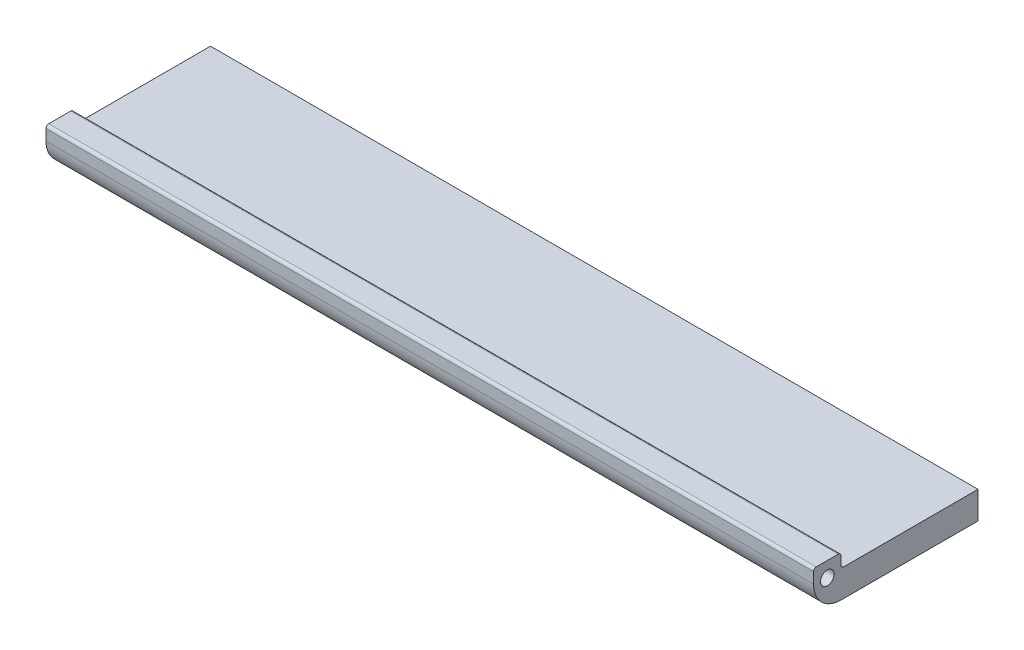
ISO-10303-21;
HEADER;
FILE_DESCRIPTION(('STEP AP214'),'2;1');
FILE_NAME('part.step','',(''),(''),'','','');
FILE_SCHEMA(('AUTOMOTIVE_DESIGN { 1 0 10303 214 1 1 1 1 }'));
ENDSEC;
DATA;
#1=APPLICATION_CONTEXT('core data for automotive mechanical design processes');
#2=APPLICATION_PROTOCOL_DEFINITION('international standard','automotive_design',2000,#1);
#3=PRODUCT_CONTEXT('',#1,'mechanical');
#4=PRODUCT('Part','Part','',(#3));
#5=PRODUCT_RELATED_PRODUCT_CATEGORY('part','',(#4));
#6=PRODUCT_DEFINITION_FORMATION('','',#4);
#7=PRODUCT_DEFINITION_CONTEXT('part definition',#1,'design');
#8=PRODUCT_DEFINITION('design','',#6,#7);
#9=PRODUCT_DEFINITION_SHAPE('','',#8);
#10=(LENGTH_UNIT() NAMED_UNIT(*) SI_UNIT(.MILLI.,.METRE.));
#11=(NAMED_UNIT(*) PLANE_ANGLE_UNIT() SI_UNIT($,.RADIAN.));
#12=(NAMED_UNIT(*) SI_UNIT($,.STERADIAN.) SOLID_ANGLE_UNIT());
#13=UNCERTAINTY_MEASURE_WITH_UNIT(LENGTH_MEASURE(1.E-05),#10,'distance_accuracy_value','');
#14=(GEOMETRIC_REPRESENTATION_CONTEXT(3) GLOBAL_UNCERTAINTY_ASSIGNED_CONTEXT((#13)) GLOBAL_UNIT_ASSIGNED_CONTEXT((#10,
#11,#12)) REPRESENTATION_CONTEXT('',''));
#15=CARTESIAN_POINT('',(0.,0.,0.));
#16=DIRECTION('',(0.,0.,1.));
#17=DIRECTION('',(1.,0.,0.));
#18=AXIS2_PLACEMENT_3D('',#15,#16,#17);
#19=CARTESIAN_POINT('',(-140.,10.,0.));
#20=DIRECTION('',(1.,0.,0.));
#21=DIRECTION('',(0.,0.,-1.));
#22=AXIS2_PLACEMENT_3D('',#19,#20,#21);
#23=PLANE('',#22);
#24=CARTESIAN_POINT('',(-140.,9.5,55.));
#25=DIRECTION('',(1.,0.,0.));
#26=DIRECTION('',(0.,0.,-1.));
#27=AXIS2_PLACEMENT_3D('',#24,#25,#26);
#28=CIRCLE('',#27,2.5);
#29=CARTESIAN_POINT('',(-140.,9.5,52.5));
#30=VERTEX_POINT('',#29);
#31=EDGE_CURVE('E157',#30,#30,#28,.T.);
#32=ORIENTED_EDGE('',*,*,#31,.T.);
#33=EDGE_LOOP('',(#32));
#34=FACE_BOUND('',#33,.T.);
#35=DIRECTION('',(0.,0.,1.));
#36=VECTOR('',#35,1.);
#37=CARTESIAN_POINT('',(-140.,15.,60.));
#38=LINE('',#37,#36);
#39=CARTESIAN_POINT('',(-140.,15.,51.));
#40=VERTEX_POINT('',#39);
#41=CARTESIAN_POINT('',(-140.,15.,59.));
#42=VERTEX_POINT('',#41);
#43=EDGE_CURVE('E155',#40,#42,#38,.T.);
#44=ORIENTED_EDGE('',*,*,#43,.F.);
#45=CARTESIAN_POINT('',(-140.,14.,51.));
#46=DIRECTION('',(1.,0.,0.));
#47=DIRECTION('',(0.,0.,-1.));
#48=AXIS2_PLACEMENT_3D('',#45,#46,#47);
#49=CIRCLE('',#48,1.);
#50=CARTESIAN_POINT('',(-140.,14.,50.));
#51=VERTEX_POINT('',#50);
#52=EDGE_CURVE('E209',#40,#51,#49,.F.);
#53=ORIENTED_EDGE('',*,*,#52,.T.);
#54=DIRECTION('',(0.,-1.,0.));
#55=VECTOR('',#54,1.);
#56=CARTESIAN_POINT('',(-140.,15.,50.));
#57=LINE('',#56,#55);
#58=CARTESIAN_POINT('',(-140.,11.,50.));
#59=VERTEX_POINT('',#58);
#60=EDGE_CURVE('E154',#51,#59,#57,.T.);
#61=ORIENTED_EDGE('',*,*,#60,.T.);
#62=CARTESIAN_POINT('',(-140.,11.,49.));
#63=DIRECTION('',(1.,0.,0.));
#64=DIRECTION('',(0.,0.,-1.));
#65=AXIS2_PLACEMENT_3D('',#62,#63,#64);
#66=CIRCLE('',#65,1.);
#67=CARTESIAN_POINT('',(-140.,10.,49.));
#68=VERTEX_POINT('',#67);
#69=EDGE_CURVE('E41',#59,#68,#66,.T.);
#70=ORIENTED_EDGE('',*,*,#69,.T.);
#71=DIRECTION('',(0.,0.,1.));
#72=VECTOR('',#71,1.);
#73=CARTESIAN_POINT('',(-140.,10.,0.));
#74=LINE('',#73,#72);
#75=CARTESIAN_POINT('',(-140.,10.,0.));
#76=VERTEX_POINT('',#75);
#77=EDGE_CURVE('E114',#76,#68,#74,.T.);
#78=ORIENTED_EDGE('',*,*,#77,.F.);
#79=DIRECTION('',(0.,-1.,0.));
#80=VECTOR('',#79,1.);
#81=CARTESIAN_POINT('',(-140.,10.,0.));
#82=LINE('',#81,#80);
#83=CARTESIAN_POINT('',(-140.,0.,0.));
#84=VERTEX_POINT('',#83);
#85=EDGE_CURVE('E125',#76,#84,#82,.T.);
#86=ORIENTED_EDGE('',*,*,#85,.T.);
#87=DIRECTION('',(0.,0.,1.));
#88=VECTOR('',#87,1.);
#89=CARTESIAN_POINT('',(-140.,0.,0.));
#90=LINE('',#89,#88);
#91=CARTESIAN_POINT('',(-140.,0.,50.));
#92=VERTEX_POINT('',#91);
#93=EDGE_CURVE('E135',#84,#92,#90,.T.);
#94=ORIENTED_EDGE('',*,*,#93,.T.);
#95=CARTESIAN_POINT('',(-140.,10.,50.));
#96=DIRECTION('',(1.,0.,0.));
#97=DIRECTION('',(0.,0.,-1.));
#98=AXIS2_PLACEMENT_3D('',#95,#96,#97);
#99=CIRCLE('',#98,10.);
#100=CARTESIAN_POINT('',(-140.,10.,60.));
#101=VERTEX_POINT('',#100);
#102=EDGE_CURVE('E224',#92,#101,#99,.F.);
#103=ORIENTED_EDGE('',*,*,#102,.T.);
#104=DIRECTION('',(0.,-1.,0.));
#105=VECTOR('',#104,1.);
#106=CARTESIAN_POINT('',(-140.,10.,60.));
#107=LINE('',#106,#105);
#108=CARTESIAN_POINT('',(-140.,14.,60.));
#109=VERTEX_POINT('',#108);
#110=EDGE_CURVE('E143',#109,#101,#107,.T.);
#111=ORIENTED_EDGE('',*,*,#110,.F.);
#112=CARTESIAN_POINT('',(-140.,14.,59.));
#113=DIRECTION('',(1.,0.,0.));
#114=DIRECTION('',(0.,0.,-1.));
#115=AXIS2_PLACEMENT_3D('',#112,#113,#114);
#116=CIRCLE('',#115,1.);
#117=EDGE_CURVE('E234',#109,#42,#116,.F.);
#118=ORIENTED_EDGE('',*,*,#117,.T.);
#119=EDGE_LOOP('',(#44,#53,#61,#70,#78,#86,#94,#103,#111,#118));
#120=FACE_BOUND('',#119,.T.);
#121=ADVANCED_FACE('F33',(#34,#120),#23,.F.);
#122=CARTESIAN_POINT('',(-140.,10.,60.));
#123=DIRECTION('',(0.,0.,-1.));
#124=DIRECTION('',(-1.,0.,0.));
#125=AXIS2_PLACEMENT_3D('',#122,#123,#124);
#126=PLANE('',#125);
#127=DIRECTION('',(0.,-1.,0.));
#128=VECTOR('',#127,1.);
#129=CARTESIAN_POINT('',(140.,10.,60.));
#130=LINE('',#129,#128);
#131=CARTESIAN_POINT('',(140.,14.,60.));
#132=VERTEX_POINT('',#131);
#133=CARTESIAN_POINT('',(140.,10.,60.));
#134=VERTEX_POINT('',#133);
#135=EDGE_CURVE('E124',#132,#134,#130,.T.);
#136=ORIENTED_EDGE('',*,*,#135,.F.);
#137=DIRECTION('',(1.,0.,0.));
#138=VECTOR('',#137,1.);
#139=CARTESIAN_POINT('',(-140.,14.,60.));
#140=LINE('',#139,#138);
#141=EDGE_CURVE('E232',#132,#109,#140,.F.);
#142=ORIENTED_EDGE('',*,*,#141,.T.);
#143=ORIENTED_EDGE('',*,*,#110,.T.);
#144=DIRECTION('',(1.,0.,0.));
#145=VECTOR('',#144,1.);
#146=CARTESIAN_POINT('',(-140.,10.,60.));
#147=LINE('',#146,#145);
#148=EDGE_CURVE('E145',#101,#134,#147,.T.);
#149=ORIENTED_EDGE('',*,*,#148,.T.);
#150=EDGE_LOOP('',(#136,#142,#143,#149));
#151=FACE_BOUND('',#150,.T.);
#152=ADVANCED_FACE('F168',(#151),#126,.F.);
#153=CARTESIAN_POINT('',(140.,10.,0.));
#154=DIRECTION('',(-1.,0.,0.));
#155=DIRECTION('',(0.,0.,1.));
#156=AXIS2_PLACEMENT_3D('',#153,#154,#155);
#157=PLANE('',#156);
#158=CARTESIAN_POINT('',(140.,9.5,55.));
#159=DIRECTION('',(1.,0.,0.));
#160=DIRECTION('',(0.,0.,-1.));
#161=AXIS2_PLACEMENT_3D('',#158,#159,#160);
#162=CIRCLE('',#161,2.5);
#163=CARTESIAN_POINT('',(140.,9.5,52.5));
#164=VERTEX_POINT('',#163);
#165=EDGE_CURVE('E160',#164,#164,#162,.T.);
#166=ORIENTED_EDGE('',*,*,#165,.F.);
#167=EDGE_LOOP('',(#166));
#168=FACE_BOUND('',#167,.T.);
#169=DIRECTION('',(0.,-1.,0.));
#170=VECTOR('',#169,1.);
#171=CARTESIAN_POINT('',(140.,15.,50.));
#172=LINE('',#171,#170);
#173=CARTESIAN_POINT('',(140.,14.,50.));
#174=VERTEX_POINT('',#173);
#175=CARTESIAN_POINT('',(140.,11.,50.));
#176=VERTEX_POINT('',#175);
#177=EDGE_CURVE('E138',#174,#176,#172,.T.);
#178=ORIENTED_EDGE('',*,*,#177,.F.);
#179=CARTESIAN_POINT('',(140.,14.,51.));
#180=DIRECTION('',(-1.,0.,0.));
#181=DIRECTION('',(0.,0.,1.));
#182=AXIS2_PLACEMENT_3D('',#179,#180,#181);
#183=CIRCLE('',#182,1.);
#184=CARTESIAN_POINT('',(140.,15.,51.));
#185=VERTEX_POINT('',#184);
#186=EDGE_CURVE('E200',#174,#185,#183,.F.);
#187=ORIENTED_EDGE('',*,*,#186,.T.);
#188=DIRECTION('',(0.,0.,-1.));
#189=VECTOR('',#188,1.);
#190=CARTESIAN_POINT('',(140.,15.,60.));
#191=LINE('',#190,#189);
#192=CARTESIAN_POINT('',(140.,15.,59.));
#193=VERTEX_POINT('',#192);
#194=EDGE_CURVE('E151',#193,#185,#191,.T.);
#195=ORIENTED_EDGE('',*,*,#194,.F.);
#196=CARTESIAN_POINT('',(140.,14.,59.));
#197=DIRECTION('',(-1.,0.,0.));
#198=DIRECTION('',(0.,0.,1.));
#199=AXIS2_PLACEMENT_3D('',#196,#197,#198);
#200=CIRCLE('',#199,1.);
#201=EDGE_CURVE('E230',#193,#132,#200,.F.);
#202=ORIENTED_EDGE('',*,*,#201,.T.);
#203=ORIENTED_EDGE('',*,*,#135,.T.);
#204=CARTESIAN_POINT('',(140.,10.,50.));
#205=DIRECTION('',(-1.,0.,0.));
#206=DIRECTION('',(0.,0.,1.));
#207=AXIS2_PLACEMENT_3D('',#204,#205,#206);
#208=CIRCLE('',#207,10.);
#209=CARTESIAN_POINT('',(140.,0.,50.));
#210=VERTEX_POINT('',#209);
#211=EDGE_CURVE('E220',#134,#210,#208,.F.);
#212=ORIENTED_EDGE('',*,*,#211,.T.);
#213=DIRECTION('',(0.,0.,-1.));
#214=VECTOR('',#213,1.);
#215=CARTESIAN_POINT('',(140.,0.,0.));
#216=LINE('',#215,#214);
#217=CARTESIAN_POINT('',(140.,0.,0.));
#218=VERTEX_POINT('',#217);
#219=EDGE_CURVE('E121',#210,#218,#216,.T.);
#220=ORIENTED_EDGE('',*,*,#219,.T.);
#221=DIRECTION('',(0.,-1.,0.));
#222=VECTOR('',#221,1.);
#223=CARTESIAN_POINT('',(140.,10.,0.));
#224=LINE('',#223,#222);
#225=CARTESIAN_POINT('',(140.,10.,0.));
#226=VERTEX_POINT('',#225);
#227=EDGE_CURVE('E117',#226,#218,#224,.T.);
#228=ORIENTED_EDGE('',*,*,#227,.F.);
#229=DIRECTION('',(0.,0.,-1.));
#230=VECTOR('',#229,1.);
#231=CARTESIAN_POINT('',(140.,10.,0.));
#232=LINE('',#231,#230);
#233=CARTESIAN_POINT('',(140.,10.,49.));
#234=VERTEX_POINT('',#233);
#235=EDGE_CURVE('E106',#234,#226,#232,.T.);
#236=ORIENTED_EDGE('',*,*,#235,.F.);
#237=CARTESIAN_POINT('',(140.,11.,49.));
#238=DIRECTION('',(-1.,0.,0.));
#239=DIRECTION('',(0.,0.,1.));
#240=AXIS2_PLACEMENT_3D('',#237,#238,#239);
#241=CIRCLE('',#240,1.);
#242=EDGE_CURVE('E11',#234,#176,#241,.T.);
#243=ORIENTED_EDGE('',*,*,#242,.T.);
#244=EDGE_LOOP('',(#178,#187,#195,#202,#203,#212,#220,#228,#236,#243));
#245=FACE_BOUND('',#244,.T.);
#246=ADVANCED_FACE('F119',(#168,#245),#157,.F.);
#247=CARTESIAN_POINT('',(-140.,10.,0.));
#248=DIRECTION('',(0.,0.,1.));
#249=DIRECTION('',(1.,0.,0.));
#250=AXIS2_PLACEMENT_3D('',#247,#248,#249);
#251=PLANE('',#250);
#252=DIRECTION('',(-1.,0.,0.));
#253=VECTOR('',#252,1.);
#254=CARTESIAN_POINT('',(-140.,0.,0.));
#255=LINE('',#254,#253);
#256=EDGE_CURVE('E140',#218,#84,#255,.T.);
#257=ORIENTED_EDGE('',*,*,#256,.T.);
#258=ORIENTED_EDGE('',*,*,#85,.F.);
#259=DIRECTION('',(-1.,0.,0.));
#260=VECTOR('',#259,1.);
#261=CARTESIAN_POINT('',(-140.,10.,0.));
#262=LINE('',#261,#260);
#263=EDGE_CURVE('E110',#226,#76,#262,.T.);
#264=ORIENTED_EDGE('',*,*,#263,.F.);
#265=ORIENTED_EDGE('',*,*,#227,.T.);
#266=EDGE_LOOP('',(#257,#258,#264,#265));
#267=FACE_BOUND('',#266,.T.);
#268=ADVANCED_FACE('F127',(#267),#251,.F.);
#269=CARTESIAN_POINT('',(0.,10.,0.));
#270=DIRECTION('',(0.,1.,0.));
#271=DIRECTION('',(0.,0.,1.));
#272=AXIS2_PLACEMENT_3D('',#269,#270,#271);
#273=PLANE('',#272);
#274=ORIENTED_EDGE('',*,*,#77,.T.);
#275=DIRECTION('',(-1.,0.,0.));
#276=VECTOR('',#275,1.);
#277=CARTESIAN_POINT('',(0.,10.,49.));
#278=LINE('',#277,#276);
#279=EDGE_CURVE('E54',#68,#234,#278,.F.);
#280=ORIENTED_EDGE('',*,*,#279,.T.);
#281=ORIENTED_EDGE('',*,*,#235,.T.);
#282=ORIENTED_EDGE('',*,*,#263,.T.);
#283=EDGE_LOOP('',(#274,#280,#281,#282));
#284=FACE_BOUND('',#283,.T.);
#285=ADVANCED_FACE('F108',(#284),#273,.T.);
#286=CARTESIAN_POINT('',(0.,0.,0.));
#287=DIRECTION('',(0.,1.,0.));
#288=DIRECTION('',(0.,0.,1.));
#289=AXIS2_PLACEMENT_3D('',#286,#287,#288);
#290=PLANE('',#289);
#291=ORIENTED_EDGE('',*,*,#219,.F.);
#292=DIRECTION('',(1.,0.,0.));
#293=VECTOR('',#292,1.);
#294=CARTESIAN_POINT('',(0.,0.,50.));
#295=LINE('',#294,#293);
#296=EDGE_CURVE('E222',#210,#92,#295,.F.);
#297=ORIENTED_EDGE('',*,*,#296,.T.);
#298=ORIENTED_EDGE('',*,*,#93,.F.);
#299=ORIENTED_EDGE('',*,*,#256,.F.);
#300=EDGE_LOOP('',(#291,#297,#298,#299));
#301=FACE_BOUND('',#300,.T.);
#302=ADVANCED_FACE('F244',(#301),#290,.F.);
#303=CARTESIAN_POINT('',(-140.,15.,50.));
#304=DIRECTION('',(0.,0.,1.));
#305=DIRECTION('',(1.,0.,0.));
#306=AXIS2_PLACEMENT_3D('',#303,#304,#305);
#307=PLANE('',#306);
#308=ORIENTED_EDGE('',*,*,#177,.T.);
#309=DIRECTION('',(-1.,0.,0.));
#310=VECTOR('',#309,1.);
#311=CARTESIAN_POINT('',(-140.,11.,50.));
#312=LINE('',#311,#310);
#313=EDGE_CURVE('E205',#176,#59,#312,.T.);
#314=ORIENTED_EDGE('',*,*,#313,.T.);
#315=ORIENTED_EDGE('',*,*,#60,.F.);
#316=DIRECTION('',(-1.,0.,0.));
#317=VECTOR('',#316,1.);
#318=CARTESIAN_POINT('',(-140.,14.,50.));
#319=LINE('',#318,#317);
#320=EDGE_CURVE('E201',#51,#174,#319,.F.);
#321=ORIENTED_EDGE('',*,*,#320,.T.);
#322=EDGE_LOOP('',(#308,#314,#315,#321));
#323=FACE_BOUND('',#322,.T.);
#324=ADVANCED_FACE('F240',(#323),#307,.F.);
#325=CARTESIAN_POINT('',(0.,15.,0.));
#326=DIRECTION('',(0.,-1.,0.));
#327=DIRECTION('',(0.,0.,-1.));
#328=AXIS2_PLACEMENT_3D('',#325,#326,#327);
#329=PLANE('',#328);
#330=ORIENTED_EDGE('',*,*,#194,.T.);
#331=DIRECTION('',(-1.,0.,0.));
#332=VECTOR('',#331,1.);
#333=CARTESIAN_POINT('',(0.,15.,51.));
#334=LINE('',#333,#332);
#335=EDGE_CURVE('E203',#185,#40,#334,.T.);
#336=ORIENTED_EDGE('',*,*,#335,.T.);
#337=ORIENTED_EDGE('',*,*,#43,.T.);
#338=DIRECTION('',(1.,0.,0.));
#339=VECTOR('',#338,1.);
#340=CARTESIAN_POINT('',(0.,15.,59.));
#341=LINE('',#340,#339);
#342=EDGE_CURVE('E227',#42,#193,#341,.T.);
#343=ORIENTED_EDGE('',*,*,#342,.T.);
#344=EDGE_LOOP('',(#330,#336,#337,#343));
#345=FACE_BOUND('',#344,.T.);
#346=ADVANCED_FACE('F243',(#345),#329,.F.);
#347=CARTESIAN_POINT('',(-140.00005,9.5,55.));
#348=DIRECTION('',(1.,0.,0.));
#349=DIRECTION('',(0.,0.,-1.));
#350=AXIS2_PLACEMENT_3D('',#347,#348,#349);
#351=CYLINDRICAL_SURFACE('',#350,2.5);
#352=CARTESIAN_POINT('',(140.,9.5,52.5));
#353=CARTESIAN_POINT('',(137.083333333333,9.5,52.5));
#354=CARTESIAN_POINT('',(134.166666666667,9.5,52.5));
#355=CARTESIAN_POINT('',(128.333333333333,9.5,52.5));
#356=CARTESIAN_POINT('',(125.416666666667,9.5,52.5));
#357=CARTESIAN_POINT('',(119.583333333333,9.5,52.5));
#358=CARTESIAN_POINT('',(116.666666666667,9.5,52.5));
#359=CARTESIAN_POINT('',(110.833333333333,9.5,52.5));
#360=CARTESIAN_POINT('',(107.916666666667,9.5,52.5));
#361=CARTESIAN_POINT('',(102.083333333333,9.5,52.5));
#362=CARTESIAN_POINT('',(99.1666666666666,9.5,52.5));
#363=CARTESIAN_POINT('',(93.3333333333333,9.5,52.5));
#364=CARTESIAN_POINT('',(90.4166666666667,9.5,52.5));
#365=CARTESIAN_POINT('',(84.5833333333333,9.5,52.5));
#366=CARTESIAN_POINT('',(81.6666666666667,9.5,52.5));
#367=CARTESIAN_POINT('',(75.8333333333333,9.5,52.5));
#368=CARTESIAN_POINT('',(72.9166666666666,9.5,52.5));
#369=CARTESIAN_POINT('',(67.0833333333333,9.5,52.5));
#370=CARTESIAN_POINT('',(64.1666666666666,9.5,52.5));
#371=CARTESIAN_POINT('',(58.3333333333333,9.5,52.5));
#372=CARTESIAN_POINT('',(55.4166666666666,9.5,52.5));
#373=CARTESIAN_POINT('',(49.5833333333333,9.5,52.5));
#374=CARTESIAN_POINT('',(46.6666666666666,9.5,52.5));
#375=CARTESIAN_POINT('',(40.8333333333333,9.5,52.5));
#376=CARTESIAN_POINT('',(37.9166666666667,9.5,52.5));
#377=CARTESIAN_POINT('',(32.0833333333333,9.5,52.5));
#378=CARTESIAN_POINT('',(29.1666666666666,9.5,52.5));
#379=CARTESIAN_POINT('',(23.3333333333333,9.5,52.5));
#380=CARTESIAN_POINT('',(20.4166666666667,9.5,52.5));
#381=CARTESIAN_POINT('',(14.5833333333333,9.5,52.5));
#382=CARTESIAN_POINT('',(11.6666666666667,9.5,52.5));
#383=CARTESIAN_POINT('',(5.83333333333331,9.5,52.5));
#384=CARTESIAN_POINT('',(2.91666666666664,9.5,52.5));
#385=CARTESIAN_POINT('',(-2.9166666666667,9.5,52.5));
#386=CARTESIAN_POINT('',(-5.83333333333337,9.5,52.5));
#387=CARTESIAN_POINT('',(-11.6666666666667,9.5,52.5));
#388=CARTESIAN_POINT('',(-14.5833333333334,9.5,52.5));
#389=CARTESIAN_POINT('',(-20.4166666666667,9.5,52.5));
#390=CARTESIAN_POINT('',(-23.3333333333333,9.5,52.5));
#391=CARTESIAN_POINT('',(-29.1666666666667,9.5,52.5));
#392=CARTESIAN_POINT('',(-32.0833333333333,9.5,52.5));
#393=CARTESIAN_POINT('',(-37.9166666666667,9.5,52.5));
#394=CARTESIAN_POINT('',(-40.8333333333333,9.5,52.5));
#395=CARTESIAN_POINT('',(-46.6666666666667,9.5,52.5));
#396=CARTESIAN_POINT('',(-49.5833333333333,9.5,52.5));
#397=CARTESIAN_POINT('',(-55.4166666666667,9.5,52.5));
#398=CARTESIAN_POINT('',(-58.3333333333333,9.5,52.5));
#399=CARTESIAN_POINT('',(-64.1666666666667,9.5,52.5));
#400=CARTESIAN_POINT('',(-67.0833333333334,9.5,52.5));
#401=CARTESIAN_POINT('',(-72.9166666666667,9.5,52.5));
#402=CARTESIAN_POINT('',(-75.8333333333333,9.5,52.5));
#403=CARTESIAN_POINT('',(-81.6666666666667,9.5,52.5));
#404=CARTESIAN_POINT('',(-84.5833333333334,9.5,52.5));
#405=CARTESIAN_POINT('',(-90.4166666666667,9.5,52.5));
#406=CARTESIAN_POINT('',(-93.3333333333333,9.5,52.5));
#407=CARTESIAN_POINT('',(-99.1666666666667,9.5,52.5));
#408=CARTESIAN_POINT('',(-102.083333333333,9.5,52.5));
#409=CARTESIAN_POINT('',(-107.916666666667,9.5,52.5));
#410=CARTESIAN_POINT('',(-110.833333333333,9.5,52.5));
#411=CARTESIAN_POINT('',(-116.666666666667,9.5,52.5));
#412=CARTESIAN_POINT('',(-119.583333333333,9.5,52.5));
#413=CARTESIAN_POINT('',(-125.416666666667,9.5,52.5));
#414=CARTESIAN_POINT('',(-128.333333333333,9.5,52.5));
#415=CARTESIAN_POINT('',(-134.166666666667,9.5,52.5));
#416=CARTESIAN_POINT('',(-137.083333333333,9.5,52.5));
#417=CARTESIAN_POINT('',(-140.,9.5,52.5));
#418=B_SPLINE_CURVE_WITH_KNOTS('',3,(#352,#353,#354,#355,#356,#357,#358,#359,#360,#361,#362,
#363,#364,#365,#366,#367,#368,#369,#370,#371,#372,#373,#374,#375,#376,#377,#378,#379,#380,#381,
#382,#383,#384,#385,#386,#387,#388,#389,#390,#391,#392,#393,#394,#395,#396,#397,#398,#399,#400,
#401,#402,#403,#404,#405,#406,#407,#408,#409,#410,#411,#412,#413,#414,#415,#416,#417),
.UNSPECIFIED.,.F.,.F.,(4,2,2,2,2,2,2,2,2,2,2,2,2,2,2,2,2,2,2,2,2,2,2,2,2,2,2,2,2,2,2,2,4),(0.,
8.74999999999998,17.5,26.25,35.,43.75,52.5,61.25,70.,78.75,87.5,96.25,105.,113.75,122.5,131.25,
140.,148.75,157.5,166.25,175.,183.75,192.5,201.25,210.,218.75,227.5,236.25,245.,253.75,262.5,
271.25,280.),.UNSPECIFIED.);
#419=EDGE_CURVE('BSEAM164',#164,#30,#418,.T.);
#420=ORIENTED_EDGE('',*,*,#165,.T.);
#421=ORIENTED_EDGE('',*,*,#31,.F.);
#422=ORIENTED_EDGE('',*,*,#419,.T.);
#423=ORIENTED_EDGE('',*,*,#419,.F.);
#424=EDGE_LOOP('',(#420,#422,#421,#423));
#425=FACE_BOUND('',#424,.T.);
#426=ADVANCED_FACE('F164',(#425),#351,.F.);
#427=CARTESIAN_POINT('',(-140.,10.,50.));
#428=DIRECTION('',(1.,0.,0.));
#429=DIRECTION('',(0.,0.,-1.));
#430=AXIS2_PLACEMENT_3D('',#427,#428,#429);
#431=CYLINDRICAL_SURFACE('',#430,10.);
#432=ORIENTED_EDGE('',*,*,#102,.F.);
#433=ORIENTED_EDGE('',*,*,#296,.F.);
#434=ORIENTED_EDGE('',*,*,#211,.F.);
#435=ORIENTED_EDGE('',*,*,#148,.F.);
#436=EDGE_LOOP('',(#432,#433,#434,#435));
#437=FACE_BOUND('',#436,.T.);
#438=ADVANCED_FACE('F183',(#437),#431,.T.);
#439=CARTESIAN_POINT('',(0.,14.,59.));
#440=DIRECTION('',(1.,0.,0.));
#441=DIRECTION('',(0.,0.,-1.));
#442=AXIS2_PLACEMENT_3D('',#439,#440,#441);
#443=CYLINDRICAL_SURFACE('',#442,1.);
#444=ORIENTED_EDGE('',*,*,#117,.F.);
#445=ORIENTED_EDGE('',*,*,#141,.F.);
#446=ORIENTED_EDGE('',*,*,#201,.F.);
#447=ORIENTED_EDGE('',*,*,#342,.F.);
#448=EDGE_LOOP('',(#444,#445,#446,#447));
#449=FACE_BOUND('',#448,.T.);
#450=ADVANCED_FACE('F186',(#449),#443,.T.);
#451=CARTESIAN_POINT('',(0.,14.,51.));
#452=DIRECTION('',(-1.,0.,0.));
#453=DIRECTION('',(0.,0.,1.));
#454=AXIS2_PLACEMENT_3D('',#451,#452,#453);
#455=CYLINDRICAL_SURFACE('',#454,1.);
#456=ORIENTED_EDGE('',*,*,#186,.F.);
#457=ORIENTED_EDGE('',*,*,#320,.F.);
#458=ORIENTED_EDGE('',*,*,#52,.F.);
#459=ORIENTED_EDGE('',*,*,#335,.F.);
#460=EDGE_LOOP('',(#456,#457,#458,#459));
#461=FACE_BOUND('',#460,.T.);
#462=ADVANCED_FACE('F189',(#461),#455,.T.);
#463=CARTESIAN_POINT('',(-140.,11.,49.));
#464=DIRECTION('',(-1.,0.,0.));
#465=DIRECTION('',(0.,0.,1.));
#466=AXIS2_PLACEMENT_3D('',#463,#464,#465);
#467=CYLINDRICAL_SURFACE('',#466,1.);
#468=ORIENTED_EDGE('',*,*,#242,.F.);
#469=ORIENTED_EDGE('',*,*,#279,.F.);
#470=ORIENTED_EDGE('',*,*,#69,.F.);
#471=ORIENTED_EDGE('',*,*,#313,.F.);
#472=EDGE_LOOP('',(#468,#469,#470,#471));
#473=FACE_BOUND('',#472,.T.);
#474=ADVANCED_FACE('F35',(#473),#467,.F.);
#475=CLOSED_SHELL('',(#121,#152,#246,#268,#285,#302,#324,#346,#426,#438,#450,#462,#474));
#476=MANIFOLD_SOLID_BREP('B2',#475);
#477=ADVANCED_BREP_SHAPE_REPRESENTATION('',(#18,#476),#14);
#478=SHAPE_DEFINITION_REPRESENTATION(#9,#477);
ENDSEC;
END-ISO-10303-21;
